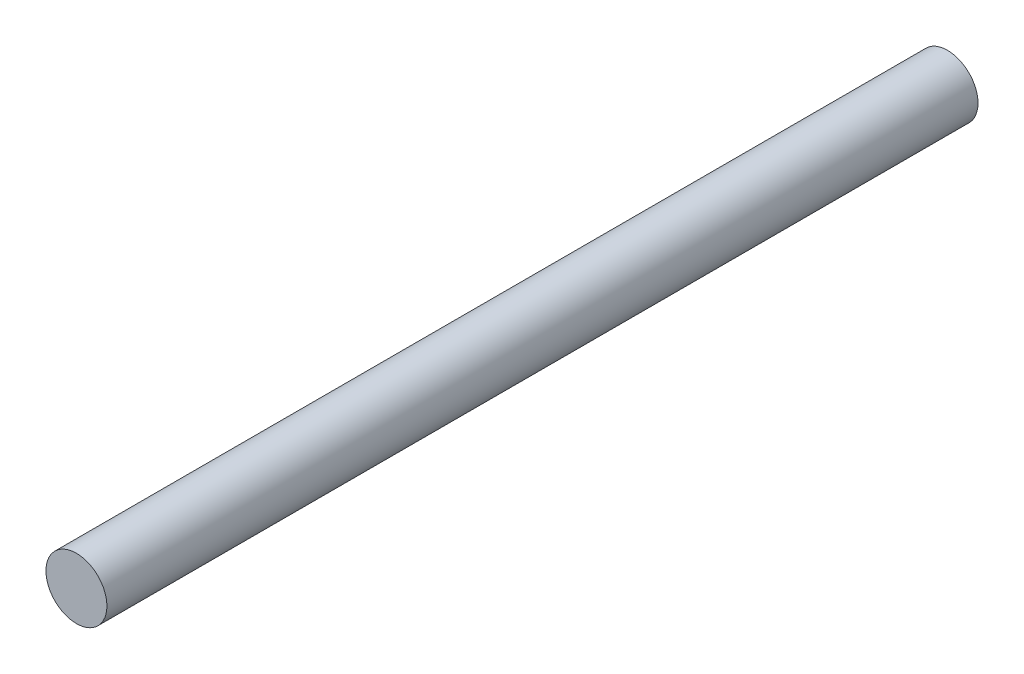
ISO-10303-21;
HEADER;
FILE_DESCRIPTION(('STEP AP214'),'2;1');
FILE_NAME('part.step','',(''),(''),'','','');
FILE_SCHEMA(('AUTOMOTIVE_DESIGN { 1 0 10303 214 1 1 1 1 }'));
ENDSEC;
DATA;
#1=APPLICATION_CONTEXT('core data for automotive mechanical design processes');
#2=APPLICATION_PROTOCOL_DEFINITION('international standard','automotive_design',2000,#1);
#3=PRODUCT_CONTEXT('',#1,'mechanical');
#4=PRODUCT('Part','Part','',(#3));
#5=PRODUCT_RELATED_PRODUCT_CATEGORY('part','',(#4));
#6=PRODUCT_DEFINITION_FORMATION('','',#4);
#7=PRODUCT_DEFINITION_CONTEXT('part definition',#1,'design');
#8=PRODUCT_DEFINITION('design','',#6,#7);
#9=PRODUCT_DEFINITION_SHAPE('','',#8);
#10=(LENGTH_UNIT() NAMED_UNIT(*) SI_UNIT(.MILLI.,.METRE.));
#11=(NAMED_UNIT(*) PLANE_ANGLE_UNIT() SI_UNIT($,.RADIAN.));
#12=(NAMED_UNIT(*) SI_UNIT($,.STERADIAN.) SOLID_ANGLE_UNIT());
#13=UNCERTAINTY_MEASURE_WITH_UNIT(LENGTH_MEASURE(1.E-05),#10,'distance_accuracy_value','');
#14=(GEOMETRIC_REPRESENTATION_CONTEXT(3) GLOBAL_UNCERTAINTY_ASSIGNED_CONTEXT((#13)) GLOBAL_UNIT_ASSIGNED_CONTEXT((#10,
#11,#12)) REPRESENTATION_CONTEXT('',''));
#15=CARTESIAN_POINT('',(0.,0.,0.));
#16=DIRECTION('',(0.,0.,1.));
#17=DIRECTION('',(1.,0.,0.));
#18=AXIS2_PLACEMENT_3D('',#15,#16,#17);
#19=CARTESIAN_POINT('',(0.,0.,28.575));
#20=DIRECTION('',(0.,0.,-1.));
#21=DIRECTION('',(-1.,0.,0.));
#22=AXIS2_PLACEMENT_3D('',#19,#20,#21);
#23=CYLINDRICAL_SURFACE('',#22,2.);
#24=CARTESIAN_POINT('',(0.,0.,28.575));
#25=DIRECTION('',(0.,0.,1.));
#26=DIRECTION('',(1.,0.,0.));
#27=AXIS2_PLACEMENT_3D('',#24,#25,#26);
#28=CIRCLE('',#27,2.);
#29=CARTESIAN_POINT('',(2.,0.,28.575));
#30=VERTEX_POINT('',#29);
#31=EDGE_CURVE('E10',#30,#30,#28,.T.);
#32=ORIENTED_EDGE('',*,*,#31,.F.);
#33=EDGE_LOOP('',(#32));
#34=FACE_BOUND('',#33,.T.);
#35=CARTESIAN_POINT('',(0.,0.,-28.575));
#36=DIRECTION('',(0.,0.,1.));
#37=DIRECTION('',(1.,0.,0.));
#38=AXIS2_PLACEMENT_3D('',#35,#36,#37);
#39=CIRCLE('',#38,2.);
#40=CARTESIAN_POINT('',(2.,0.,-28.575));
#41=VERTEX_POINT('',#40);
#42=EDGE_CURVE('E37',#41,#41,#39,.T.);
#43=ORIENTED_EDGE('',*,*,#42,.T.);
#44=EDGE_LOOP('',(#43));
#45=FACE_BOUND('',#44,.T.);
#46=ADVANCED_FACE('F34',(#34,#45),#23,.T.);
#47=CARTESIAN_POINT('',(0.,0.,28.575));
#48=DIRECTION('',(0.,0.,1.));
#49=DIRECTION('',(1.,0.,0.));
#50=AXIS2_PLACEMENT_3D('',#47,#48,#49);
#51=PLANE('',#50);
#52=ORIENTED_EDGE('',*,*,#31,.T.);
#53=EDGE_LOOP('',(#52));
#54=FACE_BOUND('',#53,.T.);
#55=ADVANCED_FACE('F49',(#54),#51,.T.);
#56=CARTESIAN_POINT('',(0.,0.,-28.575));
#57=DIRECTION('',(0.,0.,1.));
#58=DIRECTION('',(1.,0.,0.));
#59=AXIS2_PLACEMENT_3D('',#56,#57,#58);
#60=PLANE('',#59);
#61=ORIENTED_EDGE('',*,*,#42,.F.);
#62=EDGE_LOOP('',(#61));
#63=FACE_BOUND('',#62,.T.);
#64=ADVANCED_FACE('F47',(#63),#60,.F.);
#65=CLOSED_SHELL('',(#46,#55,#64));
#66=MANIFOLD_SOLID_BREP('B2',#65);
#67=ADVANCED_BREP_SHAPE_REPRESENTATION('',(#18,#66),#14);
#68=SHAPE_DEFINITION_REPRESENTATION(#9,#67);
ENDSEC;
END-ISO-10303-21;
